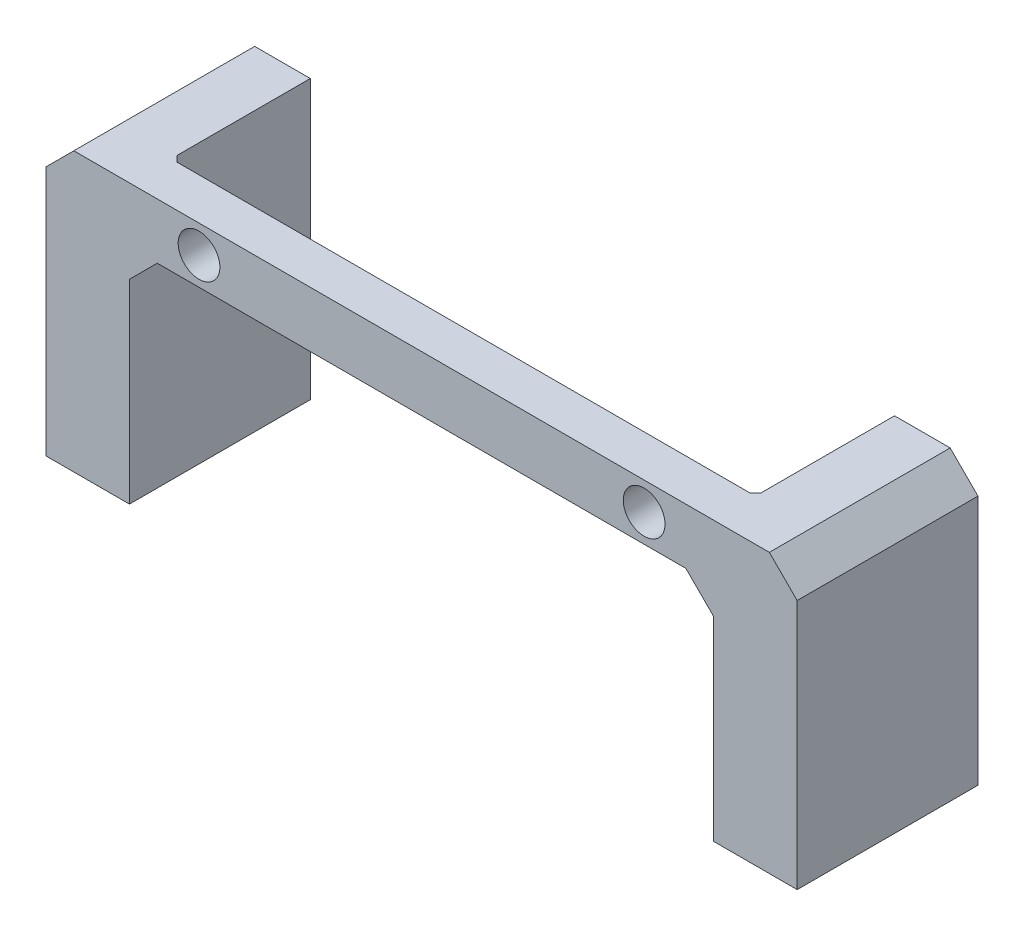
ISO-10303-21;
HEADER;
FILE_DESCRIPTION(('STEP AP214'),'2;1');
FILE_NAME('part.step','',(''),(''),'','','');
FILE_SCHEMA(('AUTOMOTIVE_DESIGN { 1 0 10303 214 1 1 1 1 }'));
ENDSEC;
DATA;
#1=APPLICATION_CONTEXT('core data for automotive mechanical design processes');
#2=APPLICATION_PROTOCOL_DEFINITION('international standard','automotive_design',2000,#1);
#3=PRODUCT_CONTEXT('',#1,'mechanical');
#4=PRODUCT('Part','Part','',(#3));
#5=PRODUCT_RELATED_PRODUCT_CATEGORY('part','',(#4));
#6=PRODUCT_DEFINITION_FORMATION('','',#4);
#7=PRODUCT_DEFINITION_CONTEXT('part definition',#1,'design');
#8=PRODUCT_DEFINITION('design','',#6,#7);
#9=PRODUCT_DEFINITION_SHAPE('','',#8);
#10=(LENGTH_UNIT() NAMED_UNIT(*) SI_UNIT(.MILLI.,.METRE.));
#11=(NAMED_UNIT(*) PLANE_ANGLE_UNIT() SI_UNIT($,.RADIAN.));
#12=(NAMED_UNIT(*) SI_UNIT($,.STERADIAN.) SOLID_ANGLE_UNIT());
#13=UNCERTAINTY_MEASURE_WITH_UNIT(LENGTH_MEASURE(1.E-05),#10,'distance_accuracy_value','');
#14=(GEOMETRIC_REPRESENTATION_CONTEXT(3) GLOBAL_UNCERTAINTY_ASSIGNED_CONTEXT((#13)) GLOBAL_UNIT_ASSIGNED_CONTEXT((#10,
#11,#12)) REPRESENTATION_CONTEXT('',''));
#15=CARTESIAN_POINT('',(0.,0.,0.));
#16=DIRECTION('',(0.,0.,1.));
#17=DIRECTION('',(1.,0.,0.));
#18=AXIS2_PLACEMENT_3D('',#15,#16,#17);
#19=CARTESIAN_POINT('',(0.,0.,0.));
#20=DIRECTION('',(0.,0.,1.));
#21=DIRECTION('',(1.,0.,0.));
#22=AXIS2_PLACEMENT_3D('',#19,#20,#21);
#23=PLANE('',#22);
#24=DIRECTION('',(0.,-1.,0.));
#25=VECTOR('',#24,1.);
#26=CARTESIAN_POINT('',(-27.,10.,0.));
#27=LINE('',#26,#25);
#28=CARTESIAN_POINT('',(-27.,8.00000000000001,0.));
#29=VERTEX_POINT('',#28);
#30=CARTESIAN_POINT('',(-27.,-10.,0.));
#31=VERTEX_POINT('',#30);
#32=EDGE_CURVE('E191',#29,#31,#27,.T.);
#33=ORIENTED_EDGE('',*,*,#32,.F.);
#34=DIRECTION('',(-0.707106781186549,-0.707106781186546,0.));
#35=VECTOR('',#34,1.);
#36=CARTESIAN_POINT('',(-27.,8.00000000000001,0.));
#37=LINE('',#36,#35);
#38=CARTESIAN_POINT('',(-25.,10.,0.));
#39=VERTEX_POINT('',#38);
#40=EDGE_CURVE('E223',#29,#39,#37,.F.);
#41=ORIENTED_EDGE('',*,*,#40,.T.);
#42=DIRECTION('',(-1.,0.,0.));
#43=VECTOR('',#42,1.);
#44=CARTESIAN_POINT('',(-27.,10.,0.));
#45=LINE('',#44,#43);
#46=CARTESIAN_POINT('',(-21.,10.,0.));
#47=VERTEX_POINT('',#46);
#48=EDGE_CURVE('E166',#47,#39,#45,.T.);
#49=ORIENTED_EDGE('',*,*,#48,.F.);
#50=DIRECTION('',(0.,-1.,0.));
#51=VECTOR('',#50,1.);
#52=CARTESIAN_POINT('',(-21.,6.,0.));
#53=LINE('',#52,#51);
#54=CARTESIAN_POINT('',(-21.,-10.,0.));
#55=VERTEX_POINT('',#54);
#56=EDGE_CURVE('E173',#47,#55,#53,.T.);
#57=ORIENTED_EDGE('',*,*,#56,.T.);
#58=DIRECTION('',(1.,0.,0.));
#59=VECTOR('',#58,1.);
#60=CARTESIAN_POINT('',(-27.,-10.,0.));
#61=LINE('',#60,#59);
#62=EDGE_CURVE('E206',#31,#55,#61,.T.);
#63=ORIENTED_EDGE('',*,*,#62,.F.);
#64=EDGE_LOOP('',(#33,#41,#49,#57,#63));
#65=FACE_BOUND('',#64,.T.);
#66=ADVANCED_FACE('F33',(#65),#23,.F.);
#67=CARTESIAN_POINT('',(-27.,-10.,13.));
#68=DIRECTION('',(0.,1.,0.));
#69=DIRECTION('',(0.,0.,1.));
#70=AXIS2_PLACEMENT_3D('',#67,#68,#69);
#71=PLANE('',#70);
#72=CARTESIAN_POINT('',(-24.,-10.,5.));
#73=DIRECTION('',(0.,-1.,0.));
#74=DIRECTION('',(0.,0.,-1.));
#75=AXIS2_PLACEMENT_3D('',#72,#73,#74);
#76=CIRCLE('',#75,1.5);
#77=CARTESIAN_POINT('',(-24.,-10.,3.5));
#78=VERTEX_POINT('',#77);
#79=EDGE_CURVE('E291',#78,#78,#76,.T.);
#80=ORIENTED_EDGE('',*,*,#79,.F.);
#81=EDGE_LOOP('',(#80));
#82=FACE_BOUND('',#81,.T.);
#83=ORIENTED_EDGE('',*,*,#62,.T.);
#84=DIRECTION('',(0.,0.,1.));
#85=VECTOR('',#84,1.);
#86=CARTESIAN_POINT('',(-21.,-10.,0.));
#87=LINE('',#86,#85);
#88=CARTESIAN_POINT('',(-21.,-10.,13.));
#89=VERTEX_POINT('',#88);
#90=EDGE_CURVE('E172',#55,#89,#87,.T.);
#91=ORIENTED_EDGE('',*,*,#90,.T.);
#92=DIRECTION('',(1.,0.,0.));
#93=VECTOR('',#92,1.);
#94=CARTESIAN_POINT('',(-27.,-10.,13.));
#95=LINE('',#94,#93);
#96=CARTESIAN_POINT('',(-27.,-10.,13.));
#97=VERTEX_POINT('',#96);
#98=EDGE_CURVE('E195',#97,#89,#95,.T.);
#99=ORIENTED_EDGE('',*,*,#98,.F.);
#100=DIRECTION('',(0.,0.,-1.));
#101=VECTOR('',#100,1.);
#102=CARTESIAN_POINT('',(-27.,-10.,13.));
#103=LINE('',#102,#101);
#104=EDGE_CURVE('E214',#97,#31,#103,.T.);
#105=ORIENTED_EDGE('',*,*,#104,.T.);
#106=EDGE_LOOP('',(#83,#91,#99,#105));
#107=FACE_BOUND('',#106,.T.);
#108=ADVANCED_FACE('F327',(#82,#107),#71,.F.);
#109=CARTESIAN_POINT('',(-27.,10.,13.));
#110=DIRECTION('',(1.,0.,0.));
#111=DIRECTION('',(0.,0.,-1.));
#112=AXIS2_PLACEMENT_3D('',#109,#110,#111);
#113=PLANE('',#112);
#114=DIRECTION('',(0.,-1.,0.));
#115=VECTOR('',#114,1.);
#116=CARTESIAN_POINT('',(-27.,10.,13.));
#117=LINE('',#116,#115);
#118=CARTESIAN_POINT('',(-27.,8.00000000000001,13.));
#119=VERTEX_POINT('',#118);
#120=EDGE_CURVE('E165',#119,#97,#117,.T.);
#121=ORIENTED_EDGE('',*,*,#120,.F.);
#122=DIRECTION('',(0.,0.,-1.));
#123=VECTOR('',#122,1.);
#124=CARTESIAN_POINT('',(-27.,8.00000000000001,13.));
#125=LINE('',#124,#123);
#126=EDGE_CURVE('E217',#119,#29,#125,.T.);
#127=ORIENTED_EDGE('',*,*,#126,.T.);
#128=ORIENTED_EDGE('',*,*,#32,.T.);
#129=ORIENTED_EDGE('',*,*,#104,.F.);
#130=EDGE_LOOP('',(#121,#127,#128,#129));
#131=FACE_BOUND('',#130,.T.);
#132=ADVANCED_FACE('F320',(#131),#113,.F.);
#133=CARTESIAN_POINT('',(24.,-10.,5.));
#134=DIRECTION('',(0.,-1.,0.));
#135=DIRECTION('',(0.,0.,1.));
#136=AXIS2_PLACEMENT_3D('',#133,#134,#135);
#137=CIRCLE('',#136,1.5);
#138=CARTESIAN_POINT('',(24.,-10.,3.5));
#139=VERTEX_POINT('',#138);
#140=EDGE_CURVE('E287',#139,#139,#137,.T.);
#141=ORIENTED_EDGE('',*,*,#140,.F.);
#142=EDGE_LOOP('',(#141));
#143=FACE_BOUND('',#142,.T.);
#144=CARTESIAN_POINT('',(21.,-10.,13.));
#145=VERTEX_POINT('',#144);
#146=CARTESIAN_POINT('',(27.,-10.,13.));
#147=VERTEX_POINT('',#146);
#148=EDGE_CURVE('E194',#145,#147,#95,.T.);
#149=ORIENTED_EDGE('',*,*,#148,.F.);
#150=DIRECTION('',(0.,0.,1.));
#151=VECTOR('',#150,1.);
#152=CARTESIAN_POINT('',(21.,-10.,0.));
#153=LINE('',#152,#151);
#154=CARTESIAN_POINT('',(21.,-10.,0.));
#155=VERTEX_POINT('',#154);
#156=EDGE_CURVE('E176',#155,#145,#153,.T.);
#157=ORIENTED_EDGE('',*,*,#156,.F.);
#158=CARTESIAN_POINT('',(27.,-10.,0.));
#159=VERTEX_POINT('',#158);
#160=EDGE_CURVE('E171',#155,#159,#61,.T.);
#161=ORIENTED_EDGE('',*,*,#160,.T.);
#162=DIRECTION('',(0.,0.,-1.));
#163=VECTOR('',#162,1.);
#164=CARTESIAN_POINT('',(27.,-10.,13.));
#165=LINE('',#164,#163);
#166=EDGE_CURVE('E204',#147,#159,#165,.T.);
#167=ORIENTED_EDGE('',*,*,#166,.F.);
#168=EDGE_LOOP('',(#149,#157,#161,#167));
#169=FACE_BOUND('',#168,.T.);
#170=ADVANCED_FACE('F344',(#143,#169),#71,.F.);
#171=CARTESIAN_POINT('',(27.,10.,13.));
#172=DIRECTION('',(-1.,0.,0.));
#173=DIRECTION('',(0.,0.,1.));
#174=AXIS2_PLACEMENT_3D('',#171,#172,#173);
#175=PLANE('',#174);
#176=DIRECTION('',(0.,1.,0.));
#177=VECTOR('',#176,1.);
#178=CARTESIAN_POINT('',(27.,10.,0.));
#179=LINE('',#178,#177);
#180=CARTESIAN_POINT('',(27.,8.,0.));
#181=VERTEX_POINT('',#180);
#182=EDGE_CURVE('E209',#159,#181,#179,.T.);
#183=ORIENTED_EDGE('',*,*,#182,.T.);
#184=DIRECTION('',(0.,0.,1.));
#185=VECTOR('',#184,1.);
#186=CARTESIAN_POINT('',(27.,8.,13.));
#187=LINE('',#186,#185);
#188=CARTESIAN_POINT('',(27.,8.,13.));
#189=VERTEX_POINT('',#188);
#190=EDGE_CURVE('E234',#181,#189,#187,.T.);
#191=ORIENTED_EDGE('',*,*,#190,.T.);
#192=DIRECTION('',(0.,1.,0.));
#193=VECTOR('',#192,1.);
#194=CARTESIAN_POINT('',(27.,10.,13.));
#195=LINE('',#194,#193);
#196=EDGE_CURVE('E198',#147,#189,#195,.T.);
#197=ORIENTED_EDGE('',*,*,#196,.F.);
#198=ORIENTED_EDGE('',*,*,#166,.T.);
#199=EDGE_LOOP('',(#183,#191,#197,#198));
#200=FACE_BOUND('',#199,.T.);
#201=ADVANCED_FACE('F351',(#200),#175,.F.);
#202=CARTESIAN_POINT('',(-27.,10.,13.));
#203=DIRECTION('',(0.,-1.,0.));
#204=DIRECTION('',(1.,0.,0.));
#205=AXIS2_PLACEMENT_3D('',#202,#203,#204);
#206=PLANE('',#205);
#207=ORIENTED_EDGE('',*,*,#48,.T.);
#208=DIRECTION('',(0.,0.,1.));
#209=VECTOR('',#208,1.);
#210=CARTESIAN_POINT('',(-25.,10.,13.));
#211=LINE('',#210,#209);
#212=CARTESIAN_POINT('',(-25.,10.,13.));
#213=VERTEX_POINT('',#212);
#214=EDGE_CURVE('E226',#39,#213,#211,.T.);
#215=ORIENTED_EDGE('',*,*,#214,.T.);
#216=DIRECTION('',(-1.,0.,0.));
#217=VECTOR('',#216,1.);
#218=CARTESIAN_POINT('',(-27.,10.,13.));
#219=LINE('',#218,#217);
#220=CARTESIAN_POINT('',(25.,10.,13.));
#221=VERTEX_POINT('',#220);
#222=EDGE_CURVE('E201',#221,#213,#219,.T.);
#223=ORIENTED_EDGE('',*,*,#222,.F.);
#224=DIRECTION('',(0.,0.,-1.));
#225=VECTOR('',#224,1.);
#226=CARTESIAN_POINT('',(25.,10.,13.));
#227=LINE('',#226,#225);
#228=CARTESIAN_POINT('',(25.,10.,0.));
#229=VERTEX_POINT('',#228);
#230=EDGE_CURVE('E163',#221,#229,#227,.T.);
#231=ORIENTED_EDGE('',*,*,#230,.T.);
#232=CARTESIAN_POINT('',(21.,10.,0.));
#233=VERTEX_POINT('',#232);
#234=EDGE_CURVE('E158',#229,#233,#45,.T.);
#235=ORIENTED_EDGE('',*,*,#234,.T.);
#236=DIRECTION('',(0.,0.,-1.));
#237=VECTOR('',#236,1.);
#238=CARTESIAN_POINT('',(21.,10.,0.));
#239=LINE('',#238,#237);
#240=CARTESIAN_POINT('',(21.,10.,9.59999999999999));
#241=VERTEX_POINT('',#240);
#242=EDGE_CURVE('E145',#241,#233,#239,.T.);
#243=ORIENTED_EDGE('',*,*,#242,.F.);
#244=DIRECTION('',(0.707106781186544,0.,-0.707106781186551));
#245=VECTOR('',#244,1.);
#246=CARTESIAN_POINT('',(-4.6999999999998,10.,35.3));
#247=LINE('',#246,#245);
#248=CARTESIAN_POINT('',(20.6,10.,10.));
#249=VERTEX_POINT('',#248);
#250=EDGE_CURVE('E261',#241,#249,#247,.F.);
#251=ORIENTED_EDGE('',*,*,#250,.T.);
#252=DIRECTION('',(1.,0.,0.));
#253=VECTOR('',#252,1.);
#254=CARTESIAN_POINT('',(-21.,10.,10.));
#255=LINE('',#254,#253);
#256=CARTESIAN_POINT('',(-20.6,10.,10.));
#257=VERTEX_POINT('',#256);
#258=EDGE_CURVE('E154',#257,#249,#255,.T.);
#259=ORIENTED_EDGE('',*,*,#258,.F.);
#260=DIRECTION('',(0.707106781186548,0.,0.707106781186548));
#261=VECTOR('',#260,1.);
#262=CARTESIAN_POINT('',(-22.3,10.,8.3));
#263=LINE('',#262,#261);
#264=CARTESIAN_POINT('',(-21.,10.,9.59999999999999));
#265=VERTEX_POINT('',#264);
#266=EDGE_CURVE('E41',#257,#265,#263,.F.);
#267=ORIENTED_EDGE('',*,*,#266,.T.);
#268=DIRECTION('',(0.,0.,1.));
#269=VECTOR('',#268,1.);
#270=CARTESIAN_POINT('',(-21.,10.,0.));
#271=LINE('',#270,#269);
#272=EDGE_CURVE('E278',#47,#265,#271,.T.);
#273=ORIENTED_EDGE('',*,*,#272,.F.);
#274=EDGE_LOOP('',(#207,#215,#223,#231,#235,#243,#251,#259,#267,#273));
#275=FACE_BOUND('',#274,.T.);
#276=ADVANCED_FACE('F160',(#275),#206,.F.);
#277=CARTESIAN_POINT('',(0.,0.,13.));
#278=DIRECTION('',(0.,0.,1.));
#279=DIRECTION('',(1.,0.,0.));
#280=AXIS2_PLACEMENT_3D('',#277,#278,#279);
#281=PLANE('',#280);
#282=CARTESIAN_POINT('',(16.,8.,13.));
#283=DIRECTION('',(0.,0.,1.));
#284=DIRECTION('',(1.,0.,0.));
#285=AXIS2_PLACEMENT_3D('',#282,#283,#284);
#286=CIRCLE('',#285,1.5);
#287=CARTESIAN_POINT('',(17.5,8.,13.));
#288=VERTEX_POINT('',#287);
#289=EDGE_CURVE('E297',#288,#288,#286,.T.);
#290=ORIENTED_EDGE('',*,*,#289,.F.);
#291=EDGE_LOOP('',(#290));
#292=FACE_BOUND('',#291,.T.);
#293=CARTESIAN_POINT('',(-16.,7.99999999999998,13.));
#294=DIRECTION('',(0.,0.,1.));
#295=DIRECTION('',(1.,0.,0.));
#296=AXIS2_PLACEMENT_3D('',#293,#294,#295);
#297=CIRCLE('',#296,1.5);
#298=CARTESIAN_POINT('',(-14.5,7.99999999999998,13.));
#299=VERTEX_POINT('',#298);
#300=EDGE_CURVE('E186',#299,#299,#297,.T.);
#301=ORIENTED_EDGE('',*,*,#300,.F.);
#302=EDGE_LOOP('',(#301));
#303=FACE_BOUND('',#302,.T.);
#304=ORIENTED_EDGE('',*,*,#222,.T.);
#305=DIRECTION('',(0.707106781186549,0.707106781186546,0.));
#306=VECTOR('',#305,1.);
#307=CARTESIAN_POINT('',(-17.5,17.5,13.));
#308=LINE('',#307,#306);
#309=EDGE_CURVE('E230',#213,#119,#308,.F.);
#310=ORIENTED_EDGE('',*,*,#309,.T.);
#311=ORIENTED_EDGE('',*,*,#120,.T.);
#312=ORIENTED_EDGE('',*,*,#98,.T.);
#313=DIRECTION('',(0.,-1.,0.));
#314=VECTOR('',#313,1.);
#315=CARTESIAN_POINT('',(-21.,6.,13.));
#316=LINE('',#315,#314);
#317=CARTESIAN_POINT('',(-21.,3.99999999999999,13.));
#318=VERTEX_POINT('',#317);
#319=EDGE_CURVE('E183',#318,#89,#316,.T.);
#320=ORIENTED_EDGE('',*,*,#319,.F.);
#321=DIRECTION('',(-0.707106781186544,-0.707106781186551,0.));
#322=VECTOR('',#321,1.);
#323=CARTESIAN_POINT('',(-21.,3.99999999999999,13.));
#324=LINE('',#323,#322);
#325=CARTESIAN_POINT('',(-19.,6.,13.));
#326=VERTEX_POINT('',#325);
#327=EDGE_CURVE('E248',#318,#326,#324,.F.);
#328=ORIENTED_EDGE('',*,*,#327,.T.);
#329=DIRECTION('',(-1.,0.,0.));
#330=VECTOR('',#329,1.);
#331=CARTESIAN_POINT('',(-21.,6.,13.));
#332=LINE('',#331,#330);
#333=CARTESIAN_POINT('',(19.,6.,13.));
#334=VERTEX_POINT('',#333);
#335=EDGE_CURVE('E179',#334,#326,#332,.T.);
#336=ORIENTED_EDGE('',*,*,#335,.F.);
#337=DIRECTION('',(-0.707106781186552,0.707106781186543,0.));
#338=VECTOR('',#337,1.);
#339=CARTESIAN_POINT('',(19.,6.,13.));
#340=LINE('',#339,#338);
#341=CARTESIAN_POINT('',(21.,4.,13.));
#342=VERTEX_POINT('',#341);
#343=EDGE_CURVE('E244',#334,#342,#340,.F.);
#344=ORIENTED_EDGE('',*,*,#343,.T.);
#345=DIRECTION('',(0.,1.,0.));
#346=VECTOR('',#345,1.);
#347=CARTESIAN_POINT('',(21.,6.,13.));
#348=LINE('',#347,#346);
#349=EDGE_CURVE('E185',#145,#342,#348,.T.);
#350=ORIENTED_EDGE('',*,*,#349,.F.);
#351=ORIENTED_EDGE('',*,*,#148,.T.);
#352=ORIENTED_EDGE('',*,*,#196,.T.);
#353=DIRECTION('',(0.707106781186546,-0.707106781186549,0.));
#354=VECTOR('',#353,1.);
#355=CARTESIAN_POINT('',(17.5000000000001,17.5,13.));
#356=LINE('',#355,#354);
#357=EDGE_CURVE('E228',#189,#221,#356,.F.);
#358=ORIENTED_EDGE('',*,*,#357,.T.);
#359=EDGE_LOOP('',(#304,#310,#311,#312,#320,#328,#336,#344,#350,#351,#352,#358));
#360=FACE_BOUND('',#359,.T.);
#361=ADVANCED_FACE('F306',(#292,#303,#360),#281,.T.);
#362=ORIENTED_EDGE('',*,*,#234,.F.);
#363=DIRECTION('',(-0.707106781186546,0.707106781186549,0.));
#364=VECTOR('',#363,1.);
#365=CARTESIAN_POINT('',(25.,10.,0.));
#366=LINE('',#365,#364);
#367=EDGE_CURVE('E232',#229,#181,#366,.F.);
#368=ORIENTED_EDGE('',*,*,#367,.T.);
#369=ORIENTED_EDGE('',*,*,#182,.F.);
#370=ORIENTED_EDGE('',*,*,#160,.F.);
#371=DIRECTION('',(0.,1.,0.));
#372=VECTOR('',#371,1.);
#373=CARTESIAN_POINT('',(21.,6.,0.));
#374=LINE('',#373,#372);
#375=EDGE_CURVE('E149',#155,#233,#374,.T.);
#376=ORIENTED_EDGE('',*,*,#375,.T.);
#377=EDGE_LOOP('',(#362,#368,#369,#370,#376));
#378=FACE_BOUND('',#377,.T.);
#379=ADVANCED_FACE('F169',(#378),#23,.F.);
#380=CARTESIAN_POINT('',(-21.,6.,0.));
#381=DIRECTION('',(-1.,0.,0.));
#382=DIRECTION('',(0.,-1.,0.));
#383=AXIS2_PLACEMENT_3D('',#380,#381,#382);
#384=PLANE('',#383);
#385=ORIENTED_EDGE('',*,*,#272,.T.);
#386=DIRECTION('',(0.,-1.,0.));
#387=VECTOR('',#386,1.);
#388=CARTESIAN_POINT('',(-21.,3.99999999999999,9.59999999999999));
#389=LINE('',#388,#387);
#390=CARTESIAN_POINT('',(-21.,3.99999999999999,9.59999999999999));
#391=VERTEX_POINT('',#390);
#392=EDGE_CURVE('E259',#265,#391,#389,.T.);
#393=ORIENTED_EDGE('',*,*,#392,.T.);
#394=DIRECTION('',(0.,0.,1.));
#395=VECTOR('',#394,1.);
#396=CARTESIAN_POINT('',(-21.,3.99999999999999,13.));
#397=LINE('',#396,#395);
#398=EDGE_CURVE('E47',#391,#318,#397,.T.);
#399=ORIENTED_EDGE('',*,*,#398,.T.);
#400=ORIENTED_EDGE('',*,*,#319,.T.);
#401=ORIENTED_EDGE('',*,*,#90,.F.);
#402=ORIENTED_EDGE('',*,*,#56,.F.);
#403=EDGE_LOOP('',(#385,#393,#399,#400,#401,#402));
#404=FACE_BOUND('',#403,.T.);
#405=ADVANCED_FACE('F331',(#404),#384,.F.);
#406=CARTESIAN_POINT('',(-21.,6.,0.));
#407=DIRECTION('',(0.,1.,0.));
#408=DIRECTION('',(0.,0.,1.));
#409=AXIS2_PLACEMENT_3D('',#406,#407,#408);
#410=PLANE('',#409);
#411=DIRECTION('',(1.,0.,0.));
#412=VECTOR('',#411,1.);
#413=CARTESIAN_POINT('',(-21.,6.,10.));
#414=LINE('',#413,#412);
#415=CARTESIAN_POINT('',(-19.,6.,10.));
#416=VERTEX_POINT('',#415);
#417=CARTESIAN_POINT('',(19.,6.,10.));
#418=VERTEX_POINT('',#417);
#419=EDGE_CURVE('E284',#416,#418,#414,.T.);
#420=ORIENTED_EDGE('',*,*,#419,.T.);
#421=DIRECTION('',(0.,0.,1.));
#422=VECTOR('',#421,1.);
#423=CARTESIAN_POINT('',(19.,6.,13.));
#424=LINE('',#423,#422);
#425=EDGE_CURVE('E238',#418,#334,#424,.T.);
#426=ORIENTED_EDGE('',*,*,#425,.T.);
#427=ORIENTED_EDGE('',*,*,#335,.T.);
#428=DIRECTION('',(0.,0.,-1.));
#429=VECTOR('',#428,1.);
#430=CARTESIAN_POINT('',(-19.,6.,10.));
#431=LINE('',#430,#429);
#432=EDGE_CURVE('E236',#326,#416,#431,.T.);
#433=ORIENTED_EDGE('',*,*,#432,.T.);
#434=EDGE_LOOP('',(#420,#426,#427,#433));
#435=FACE_BOUND('',#434,.T.);
#436=ADVANCED_FACE('F340',(#435),#410,.F.);
#437=CARTESIAN_POINT('',(21.,6.,0.));
#438=DIRECTION('',(1.,0.,0.));
#439=DIRECTION('',(0.,1.,0.));
#440=AXIS2_PLACEMENT_3D('',#437,#438,#439);
#441=PLANE('',#440);
#442=DIRECTION('',(0.,0.,-1.));
#443=VECTOR('',#442,1.);
#444=CARTESIAN_POINT('',(21.,4.,10.));
#445=LINE('',#444,#443);
#446=CARTESIAN_POINT('',(21.,4.,9.59999999999999));
#447=VERTEX_POINT('',#446);
#448=EDGE_CURVE('E241',#342,#447,#445,.T.);
#449=ORIENTED_EDGE('',*,*,#448,.T.);
#450=DIRECTION('',(0.,1.,0.));
#451=VECTOR('',#450,1.);
#452=CARTESIAN_POINT('',(21.,10.,9.59999999999999));
#453=LINE('',#452,#451);
#454=EDGE_CURVE('E152',#447,#241,#453,.T.);
#455=ORIENTED_EDGE('',*,*,#454,.T.);
#456=ORIENTED_EDGE('',*,*,#242,.T.);
#457=ORIENTED_EDGE('',*,*,#375,.F.);
#458=ORIENTED_EDGE('',*,*,#156,.T.);
#459=ORIENTED_EDGE('',*,*,#349,.T.);
#460=EDGE_LOOP('',(#449,#455,#456,#457,#458,#459));
#461=FACE_BOUND('',#460,.T.);
#462=ADVANCED_FACE('F147',(#461),#441,.F.);
#463=CARTESIAN_POINT('',(-16.,7.99999999999998,0.));
#464=DIRECTION('',(0.,0.,1.));
#465=DIRECTION('',(1.,0.,0.));
#466=AXIS2_PLACEMENT_3D('',#463,#464,#465);
#467=CYLINDRICAL_SURFACE('',#466,1.5);
#468=CARTESIAN_POINT('',(-16.,7.99999999999998,10.));
#469=DIRECTION('',(0.,0.,1.));
#470=DIRECTION('',(1.,0.,0.));
#471=AXIS2_PLACEMENT_3D('',#468,#469,#470);
#472=CIRCLE('',#471,1.5);
#473=CARTESIAN_POINT('',(-14.5,7.99999999999998,10.));
#474=VERTEX_POINT('',#473);
#475=EDGE_CURVE('E220',#474,#474,#472,.F.);
#476=CARTESIAN_POINT('',(-14.5,7.99999999999998,10.));
#477=CARTESIAN_POINT('',(-14.5,7.99999999999998,10.03125));
#478=CARTESIAN_POINT('',(-14.5,7.99999999999998,10.0625));
#479=CARTESIAN_POINT('',(-14.5,7.99999999999998,10.125));
#480=CARTESIAN_POINT('',(-14.5,7.99999999999998,10.15625));
#481=CARTESIAN_POINT('',(-14.5,7.99999999999998,10.21875));
#482=CARTESIAN_POINT('',(-14.5,7.99999999999998,10.25));
#483=CARTESIAN_POINT('',(-14.5,7.99999999999998,10.3125));
#484=CARTESIAN_POINT('',(-14.5,7.99999999999998,10.34375));
#485=CARTESIAN_POINT('',(-14.5,7.99999999999998,10.40625));
#486=CARTESIAN_POINT('',(-14.5,7.99999999999998,10.4375));
#487=CARTESIAN_POINT('',(-14.5,7.99999999999998,10.5));
#488=CARTESIAN_POINT('',(-14.5,7.99999999999998,10.53125));
#489=CARTESIAN_POINT('',(-14.5,7.99999999999998,10.59375));
#490=CARTESIAN_POINT('',(-14.5,7.99999999999998,10.625));
#491=CARTESIAN_POINT('',(-14.5,7.99999999999998,10.6875));
#492=CARTESIAN_POINT('',(-14.5,7.99999999999998,10.71875));
#493=CARTESIAN_POINT('',(-14.5,7.99999999999998,10.78125));
#494=CARTESIAN_POINT('',(-14.5,7.99999999999998,10.8125));
#495=CARTESIAN_POINT('',(-14.5,7.99999999999998,10.875));
#496=CARTESIAN_POINT('',(-14.5,7.99999999999998,10.90625));
#497=CARTESIAN_POINT('',(-14.5,7.99999999999998,10.96875));
#498=CARTESIAN_POINT('',(-14.5,7.99999999999998,11.));
#499=CARTESIAN_POINT('',(-14.5,7.99999999999998,11.0625));
#500=CARTESIAN_POINT('',(-14.5,7.99999999999998,11.09375));
#501=CARTESIAN_POINT('',(-14.5,7.99999999999998,11.15625));
#502=CARTESIAN_POINT('',(-14.5,7.99999999999998,11.1875));
#503=CARTESIAN_POINT('',(-14.5,7.99999999999998,11.25));
#504=CARTESIAN_POINT('',(-14.5,7.99999999999998,11.28125));
#505=CARTESIAN_POINT('',(-14.5,7.99999999999998,11.34375));
#506=CARTESIAN_POINT('',(-14.5,7.99999999999998,11.375));
#507=CARTESIAN_POINT('',(-14.5,7.99999999999998,11.4375));
#508=CARTESIAN_POINT('',(-14.5,7.99999999999998,11.46875));
#509=CARTESIAN_POINT('',(-14.5,7.99999999999998,11.53125));
#510=CARTESIAN_POINT('',(-14.5,7.99999999999998,11.5625));
#511=CARTESIAN_POINT('',(-14.5,7.99999999999998,11.625));
#512=CARTESIAN_POINT('',(-14.5,7.99999999999998,11.65625));
#513=CARTESIAN_POINT('',(-14.5,7.99999999999998,11.71875));
#514=CARTESIAN_POINT('',(-14.5,7.99999999999998,11.75));
#515=CARTESIAN_POINT('',(-14.5,7.99999999999998,11.8125));
#516=CARTESIAN_POINT('',(-14.5,7.99999999999998,11.84375));
#517=CARTESIAN_POINT('',(-14.5,7.99999999999998,11.90625));
#518=CARTESIAN_POINT('',(-14.5,7.99999999999998,11.9375));
#519=CARTESIAN_POINT('',(-14.5,7.99999999999998,12.));
#520=CARTESIAN_POINT('',(-14.5,7.99999999999998,12.03125));
#521=CARTESIAN_POINT('',(-14.5,7.99999999999998,12.09375));
#522=CARTESIAN_POINT('',(-14.5,7.99999999999998,12.125));
#523=CARTESIAN_POINT('',(-14.5,7.99999999999998,12.1875));
#524=CARTESIAN_POINT('',(-14.5,7.99999999999998,12.21875));
#525=CARTESIAN_POINT('',(-14.5,7.99999999999998,12.28125));
#526=CARTESIAN_POINT('',(-14.5,7.99999999999998,12.3125));
#527=CARTESIAN_POINT('',(-14.5,7.99999999999998,12.375));
#528=CARTESIAN_POINT('',(-14.5,7.99999999999998,12.40625));
#529=CARTESIAN_POINT('',(-14.5,7.99999999999998,12.46875));
#530=CARTESIAN_POINT('',(-14.5,7.99999999999998,12.5));
#531=CARTESIAN_POINT('',(-14.5,7.99999999999998,12.5625));
#532=CARTESIAN_POINT('',(-14.5,7.99999999999998,12.59375));
#533=CARTESIAN_POINT('',(-14.5,7.99999999999998,12.65625));
#534=CARTESIAN_POINT('',(-14.5,7.99999999999998,12.6875));
#535=CARTESIAN_POINT('',(-14.5,7.99999999999998,12.75));
#536=CARTESIAN_POINT('',(-14.5,7.99999999999998,12.78125));
#537=CARTESIAN_POINT('',(-14.5,7.99999999999998,12.84375));
#538=CARTESIAN_POINT('',(-14.5,7.99999999999998,12.875));
#539=CARTESIAN_POINT('',(-14.5,7.99999999999998,12.9375));
#540=CARTESIAN_POINT('',(-14.5,7.99999999999998,12.96875));
#541=CARTESIAN_POINT('',(-14.5,7.99999999999998,13.));
#542=B_SPLINE_CURVE_WITH_KNOTS('',3,(#476,#477,#478,#479,#480,#481,#482,#483,#484,#485,#486,
#487,#488,#489,#490,#491,#492,#493,#494,#495,#496,#497,#498,#499,#500,#501,#502,#503,#504,#505,
#506,#507,#508,#509,#510,#511,#512,#513,#514,#515,#516,#517,#518,#519,#520,#521,#522,#523,#524,
#525,#526,#527,#528,#529,#530,#531,#532,#533,#534,#535,#536,#537,#538,#539,#540,#541),
.UNSPECIFIED.,.F.,.F.,(4,2,2,2,2,2,2,2,2,2,2,2,2,2,2,2,2,2,2,2,2,2,2,2,2,2,2,2,2,2,2,2,4),(0.,
0.0937500000000001,0.1875,0.28125,0.375,0.46875,0.5625,0.656250000000001,0.750000000000001,
0.843749999999999,0.937499999999999,1.03125,1.125,1.21875,1.3125,1.40625,1.5,1.59375,1.6875,
1.78125,1.875,1.96875,2.0625,2.15625,2.25,2.34375,2.4375,2.53125,2.625,2.71875,2.8125,2.90625,
3.),.UNSPECIFIED.);
#543=EDGE_CURVE('BSEAM304',#474,#299,#542,.T.);
#544=ORIENTED_EDGE('',*,*,#475,.T.);
#545=ORIENTED_EDGE('',*,*,#300,.T.);
#546=ORIENTED_EDGE('',*,*,#543,.T.);
#547=ORIENTED_EDGE('',*,*,#543,.F.);
#548=EDGE_LOOP('',(#544,#546,#545,#547));
#549=FACE_BOUND('',#548,.T.);
#550=ADVANCED_FACE('F304',(#549),#467,.F.);
#551=CARTESIAN_POINT('',(16.,8.,0.));
#552=DIRECTION('',(0.,0.,1.));
#553=DIRECTION('',(1.,0.,0.));
#554=AXIS2_PLACEMENT_3D('',#551,#552,#553);
#555=CYLINDRICAL_SURFACE('',#554,1.5);
#556=CARTESIAN_POINT('',(16.,8.,10.));
#557=DIRECTION('',(0.,0.,1.));
#558=DIRECTION('',(1.,0.,0.));
#559=AXIS2_PLACEMENT_3D('',#556,#557,#558);
#560=CIRCLE('',#559,1.5);
#561=CARTESIAN_POINT('',(17.5,8.,10.));
#562=VERTEX_POINT('',#561);
#563=EDGE_CURVE('E153',#562,#562,#560,.F.);
#564=CARTESIAN_POINT('',(17.5,8.,10.));
#565=CARTESIAN_POINT('',(17.5,8.,10.03125));
#566=CARTESIAN_POINT('',(17.5,8.,10.0625));
#567=CARTESIAN_POINT('',(17.5,8.,10.125));
#568=CARTESIAN_POINT('',(17.5,8.,10.15625));
#569=CARTESIAN_POINT('',(17.5,8.,10.21875));
#570=CARTESIAN_POINT('',(17.5,8.,10.25));
#571=CARTESIAN_POINT('',(17.5,8.,10.3125));
#572=CARTESIAN_POINT('',(17.5,8.,10.34375));
#573=CARTESIAN_POINT('',(17.5,8.,10.40625));
#574=CARTESIAN_POINT('',(17.5,8.,10.4375));
#575=CARTESIAN_POINT('',(17.5,8.,10.5));
#576=CARTESIAN_POINT('',(17.5,8.,10.53125));
#577=CARTESIAN_POINT('',(17.5,8.,10.59375));
#578=CARTESIAN_POINT('',(17.5,8.,10.625));
#579=CARTESIAN_POINT('',(17.5,8.,10.6875));
#580=CARTESIAN_POINT('',(17.5,8.,10.71875));
#581=CARTESIAN_POINT('',(17.5,8.,10.78125));
#582=CARTESIAN_POINT('',(17.5,8.,10.8125));
#583=CARTESIAN_POINT('',(17.5,8.,10.875));
#584=CARTESIAN_POINT('',(17.5,8.,10.90625));
#585=CARTESIAN_POINT('',(17.5,8.,10.96875));
#586=CARTESIAN_POINT('',(17.5,8.,11.));
#587=CARTESIAN_POINT('',(17.5,8.,11.0625));
#588=CARTESIAN_POINT('',(17.5,8.,11.09375));
#589=CARTESIAN_POINT('',(17.5,8.,11.15625));
#590=CARTESIAN_POINT('',(17.5,8.,11.1875));
#591=CARTESIAN_POINT('',(17.5,8.,11.25));
#592=CARTESIAN_POINT('',(17.5,8.,11.28125));
#593=CARTESIAN_POINT('',(17.5,8.,11.34375));
#594=CARTESIAN_POINT('',(17.5,8.,11.375));
#595=CARTESIAN_POINT('',(17.5,8.,11.4375));
#596=CARTESIAN_POINT('',(17.5,8.,11.46875));
#597=CARTESIAN_POINT('',(17.5,8.,11.53125));
#598=CARTESIAN_POINT('',(17.5,8.,11.5625));
#599=CARTESIAN_POINT('',(17.5,8.,11.625));
#600=CARTESIAN_POINT('',(17.5,8.,11.65625));
#601=CARTESIAN_POINT('',(17.5,8.,11.71875));
#602=CARTESIAN_POINT('',(17.5,8.,11.75));
#603=CARTESIAN_POINT('',(17.5,8.,11.8125));
#604=CARTESIAN_POINT('',(17.5,8.,11.84375));
#605=CARTESIAN_POINT('',(17.5,8.,11.90625));
#606=CARTESIAN_POINT('',(17.5,8.,11.9375));
#607=CARTESIAN_POINT('',(17.5,8.,12.));
#608=CARTESIAN_POINT('',(17.5,8.,12.03125));
#609=CARTESIAN_POINT('',(17.5,8.,12.09375));
#610=CARTESIAN_POINT('',(17.5,8.,12.125));
#611=CARTESIAN_POINT('',(17.5,8.,12.1875));
#612=CARTESIAN_POINT('',(17.5,8.,12.21875));
#613=CARTESIAN_POINT('',(17.5,8.,12.28125));
#614=CARTESIAN_POINT('',(17.5,8.,12.3125));
#615=CARTESIAN_POINT('',(17.5,8.,12.375));
#616=CARTESIAN_POINT('',(17.5,8.,12.40625));
#617=CARTESIAN_POINT('',(17.5,8.,12.46875));
#618=CARTESIAN_POINT('',(17.5,8.,12.5));
#619=CARTESIAN_POINT('',(17.5,8.,12.5625));
#620=CARTESIAN_POINT('',(17.5,8.,12.59375));
#621=CARTESIAN_POINT('',(17.5,8.,12.65625));
#622=CARTESIAN_POINT('',(17.5,8.,12.6875));
#623=CARTESIAN_POINT('',(17.5,8.,12.75));
#624=CARTESIAN_POINT('',(17.5,8.,12.78125));
#625=CARTESIAN_POINT('',(17.5,8.,12.84375));
#626=CARTESIAN_POINT('',(17.5,8.,12.875));
#627=CARTESIAN_POINT('',(17.5,8.,12.9375));
#628=CARTESIAN_POINT('',(17.5,8.,12.96875));
#629=CARTESIAN_POINT('',(17.5,8.,13.));
#630=B_SPLINE_CURVE_WITH_KNOTS('',3,(#564,#565,#566,#567,#568,#569,#570,#571,#572,#573,#574,
#575,#576,#577,#578,#579,#580,#581,#582,#583,#584,#585,#586,#587,#588,#589,#590,#591,#592,#593,
#594,#595,#596,#597,#598,#599,#600,#601,#602,#603,#604,#605,#606,#607,#608,#609,#610,#611,#612,
#613,#614,#615,#616,#617,#618,#619,#620,#621,#622,#623,#624,#625,#626,#627,#628,#629),
.UNSPECIFIED.,.F.,.F.,(4,2,2,2,2,2,2,2,2,2,2,2,2,2,2,2,2,2,2,2,2,2,2,2,2,2,2,2,2,2,2,2,4),(0.,
0.0937500000000001,0.1875,0.28125,0.375,0.46875,0.5625,0.656250000000001,0.750000000000001,
0.843749999999999,0.937499999999999,1.03125,1.125,1.21875,1.3125,1.40625,1.5,1.59375,1.6875,
1.78125,1.875,1.96875,2.0625,2.15625,2.25,2.34375,2.4375,2.53125,2.625,2.71875,2.8125,2.90625,
3.),.UNSPECIFIED.);
#631=EDGE_CURVE('BSEAM381',#562,#288,#630,.T.);
#632=ORIENTED_EDGE('',*,*,#563,.T.);
#633=ORIENTED_EDGE('',*,*,#289,.T.);
#634=ORIENTED_EDGE('',*,*,#631,.T.);
#635=ORIENTED_EDGE('',*,*,#631,.F.);
#636=EDGE_LOOP('',(#632,#634,#633,#635));
#637=FACE_BOUND('',#636,.T.);
#638=ADVANCED_FACE('F381',(#637),#555,.F.);
#639=CARTESIAN_POINT('',(-24.,3.,5.));
#640=DIRECTION('',(0.,-1.,0.));
#641=DIRECTION('',(0.,0.,-1.));
#642=AXIS2_PLACEMENT_3D('',#639,#640,#641);
#643=CYLINDRICAL_SURFACE('',#642,1.5);
#644=CARTESIAN_POINT('',(-24.,3.,5.));
#645=DIRECTION('',(0.,-1.,0.));
#646=DIRECTION('',(0.,0.,-1.));
#647=AXIS2_PLACEMENT_3D('',#644,#645,#646);
#648=CIRCLE('',#647,1.5);
#649=CARTESIAN_POINT('',(-24.,3.,3.5));
#650=VERTEX_POINT('',#649);
#651=EDGE_CURVE('E294',#650,#650,#648,.T.);
#652=CARTESIAN_POINT('',(-24.,3.,3.5));
#653=CARTESIAN_POINT('',(-24.,2.86458333333333,3.5));
#654=CARTESIAN_POINT('',(-24.,2.72916666666666,3.5));
#655=CARTESIAN_POINT('',(-24.,2.45833333333333,3.5));
#656=CARTESIAN_POINT('',(-24.,2.32291666666666,3.5));
#657=CARTESIAN_POINT('',(-24.,2.05208333333333,3.5));
#658=CARTESIAN_POINT('',(-24.,1.91666666666666,3.5));
#659=CARTESIAN_POINT('',(-24.,1.64583333333333,3.5));
#660=CARTESIAN_POINT('',(-24.,1.51041666666666,3.5));
#661=CARTESIAN_POINT('',(-24.,1.23958333333333,3.5));
#662=CARTESIAN_POINT('',(-24.,1.10416666666666,3.5));
#663=CARTESIAN_POINT('',(-24.,0.833333333333331,3.5));
#664=CARTESIAN_POINT('',(-24.,0.697916666666665,3.5));
#665=CARTESIAN_POINT('',(-24.,0.427083333333331,3.5));
#666=CARTESIAN_POINT('',(-24.,0.291666666666665,3.5));
#667=CARTESIAN_POINT('',(-24.,0.0208333333333313,3.5));
#668=CARTESIAN_POINT('',(-24.,-0.114583333333335,3.5));
#669=CARTESIAN_POINT('',(-24.,-0.385416666666669,3.5));
#670=CARTESIAN_POINT('',(-24.,-0.520833333333335,3.5));
#671=CARTESIAN_POINT('',(-24.,-0.791666666666669,3.5));
#672=CARTESIAN_POINT('',(-24.,-0.927083333333335,3.5));
#673=CARTESIAN_POINT('',(-24.,-1.19791666666667,3.5));
#674=CARTESIAN_POINT('',(-24.,-1.33333333333334,3.5));
#675=CARTESIAN_POINT('',(-24.,-1.60416666666667,3.5));
#676=CARTESIAN_POINT('',(-24.,-1.73958333333334,3.5));
#677=CARTESIAN_POINT('',(-24.,-2.01041666666667,3.5));
#678=CARTESIAN_POINT('',(-24.,-2.14583333333334,3.5));
#679=CARTESIAN_POINT('',(-24.,-2.41666666666667,3.5));
#680=CARTESIAN_POINT('',(-24.,-2.55208333333334,3.5));
#681=CARTESIAN_POINT('',(-24.,-2.82291666666667,3.5));
#682=CARTESIAN_POINT('',(-24.,-2.95833333333334,3.5));
#683=CARTESIAN_POINT('',(-24.,-3.22916666666667,3.5));
#684=CARTESIAN_POINT('',(-24.,-3.36458333333334,3.5));
#685=CARTESIAN_POINT('',(-24.,-3.63541666666667,3.5));
#686=CARTESIAN_POINT('',(-24.,-3.77083333333334,3.5));
#687=CARTESIAN_POINT('',(-24.,-4.04166666666667,3.5));
#688=CARTESIAN_POINT('',(-24.,-4.17708333333334,3.5));
#689=CARTESIAN_POINT('',(-24.,-4.44791666666667,3.5));
#690=CARTESIAN_POINT('',(-24.,-4.58333333333334,3.5));
#691=CARTESIAN_POINT('',(-24.,-4.85416666666667,3.5));
#692=CARTESIAN_POINT('',(-24.,-4.98958333333333,3.5));
#693=CARTESIAN_POINT('',(-24.,-5.26041666666667,3.5));
#694=CARTESIAN_POINT('',(-24.,-5.39583333333333,3.5));
#695=CARTESIAN_POINT('',(-24.,-5.66666666666667,3.5));
#696=CARTESIAN_POINT('',(-24.,-5.80208333333334,3.5));
#697=CARTESIAN_POINT('',(-24.,-6.07291666666667,3.5));
#698=CARTESIAN_POINT('',(-24.,-6.20833333333334,3.5));
#699=CARTESIAN_POINT('',(-24.,-6.47916666666667,3.5));
#700=CARTESIAN_POINT('',(-24.,-6.61458333333334,3.5));
#701=CARTESIAN_POINT('',(-24.,-6.88541666666667,3.5));
#702=CARTESIAN_POINT('',(-24.,-7.02083333333333,3.5));
#703=CARTESIAN_POINT('',(-24.,-7.29166666666667,3.5));
#704=CARTESIAN_POINT('',(-24.,-7.42708333333333,3.5));
#705=CARTESIAN_POINT('',(-24.,-7.69791666666667,3.5));
#706=CARTESIAN_POINT('',(-24.,-7.83333333333333,3.5));
#707=CARTESIAN_POINT('',(-24.,-8.10416666666667,3.5));
#708=CARTESIAN_POINT('',(-24.,-8.23958333333334,3.5));
#709=CARTESIAN_POINT('',(-24.,-8.51041666666667,3.5));
#710=CARTESIAN_POINT('',(-24.,-8.64583333333334,3.5));
#711=CARTESIAN_POINT('',(-24.,-8.91666666666667,3.5));
#712=CARTESIAN_POINT('',(-24.,-9.05208333333334,3.5));
#713=CARTESIAN_POINT('',(-24.,-9.32291666666667,3.5));
#714=CARTESIAN_POINT('',(-24.,-9.45833333333333,3.5));
#715=CARTESIAN_POINT('',(-24.,-9.72916666666667,3.5));
#716=CARTESIAN_POINT('',(-24.,-9.86458333333333,3.5));
#717=CARTESIAN_POINT('',(-24.,-10.,3.5));
#718=B_SPLINE_CURVE_WITH_KNOTS('',3,(#652,#653,#654,#655,#656,#657,#658,#659,#660,#661,#662,
#663,#664,#665,#666,#667,#668,#669,#670,#671,#672,#673,#674,#675,#676,#677,#678,#679,#680,#681,
#682,#683,#684,#685,#686,#687,#688,#689,#690,#691,#692,#693,#694,#695,#696,#697,#698,#699,#700,
#701,#702,#703,#704,#705,#706,#707,#708,#709,#710,#711,#712,#713,#714,#715,#716,#717),
.UNSPECIFIED.,.F.,.F.,(4,2,2,2,2,2,2,2,2,2,2,2,2,2,2,2,2,2,2,2,2,2,2,2,2,2,2,2,2,2,2,2,4),(0.,
0.40625,0.8125,1.21875,1.625,2.03125,2.4375,2.84375,3.25,3.65625,4.0625,4.46875,4.875,5.28125,
5.6875,6.09375,6.5,6.90625,7.3125,7.71875,8.125,8.53125,8.9375,9.34375,9.75,10.15625,10.5625,
10.96875,11.375,11.78125,12.1875,12.59375,13.),.UNSPECIFIED.);
#719=EDGE_CURVE('BSEAM385',#650,#78,#718,.T.);
#720=ORIENTED_EDGE('',*,*,#651,.F.);
#721=ORIENTED_EDGE('',*,*,#79,.T.);
#722=ORIENTED_EDGE('',*,*,#719,.T.);
#723=ORIENTED_EDGE('',*,*,#719,.F.);
#724=EDGE_LOOP('',(#720,#722,#721,#723));
#725=FACE_BOUND('',#724,.T.);
#726=ADVANCED_FACE('F385',(#725),#643,.F.);
#727=CARTESIAN_POINT('',(-24.,3.,5.));
#728=DIRECTION('',(0.,-1.,0.));
#729=DIRECTION('',(0.,0.,-1.));
#730=AXIS2_PLACEMENT_3D('',#727,#728,#729);
#731=PLANE('',#730);
#732=ORIENTED_EDGE('',*,*,#651,.T.);
#733=EDGE_LOOP('',(#732));
#734=FACE_BOUND('',#733,.T.);
#735=ADVANCED_FACE('F389',(#734),#731,.T.);
#736=CARTESIAN_POINT('',(24.,3.,5.));
#737=DIRECTION('',(0.,-1.,0.));
#738=DIRECTION('',(0.,0.,-1.));
#739=AXIS2_PLACEMENT_3D('',#736,#737,#738);
#740=CYLINDRICAL_SURFACE('',#739,1.5);
#741=CARTESIAN_POINT('',(24.,3.,5.));
#742=DIRECTION('',(0.,-1.,0.));
#743=DIRECTION('',(0.,0.,1.));
#744=AXIS2_PLACEMENT_3D('',#741,#742,#743);
#745=CIRCLE('',#744,1.5);
#746=CARTESIAN_POINT('',(24.,3.,3.5));
#747=VERTEX_POINT('',#746);
#748=EDGE_CURVE('E288',#747,#747,#745,.T.);
#749=CARTESIAN_POINT('',(24.,3.,3.5));
#750=CARTESIAN_POINT('',(24.,2.86458333333333,3.5));
#751=CARTESIAN_POINT('',(24.,2.72916666666666,3.5));
#752=CARTESIAN_POINT('',(24.,2.45833333333333,3.5));
#753=CARTESIAN_POINT('',(24.,2.32291666666666,3.5));
#754=CARTESIAN_POINT('',(24.,2.05208333333333,3.5));
#755=CARTESIAN_POINT('',(24.,1.91666666666666,3.5));
#756=CARTESIAN_POINT('',(24.,1.64583333333333,3.5));
#757=CARTESIAN_POINT('',(24.,1.51041666666666,3.5));
#758=CARTESIAN_POINT('',(24.,1.23958333333333,3.5));
#759=CARTESIAN_POINT('',(24.,1.10416666666666,3.5));
#760=CARTESIAN_POINT('',(24.,0.833333333333331,3.5));
#761=CARTESIAN_POINT('',(24.,0.697916666666665,3.5));
#762=CARTESIAN_POINT('',(24.,0.427083333333331,3.5));
#763=CARTESIAN_POINT('',(24.,0.291666666666665,3.5));
#764=CARTESIAN_POINT('',(24.,0.0208333333333313,3.5));
#765=CARTESIAN_POINT('',(24.,-0.114583333333335,3.5));
#766=CARTESIAN_POINT('',(24.,-0.385416666666669,3.5));
#767=CARTESIAN_POINT('',(24.,-0.520833333333335,3.5));
#768=CARTESIAN_POINT('',(24.,-0.791666666666669,3.5));
#769=CARTESIAN_POINT('',(24.,-0.927083333333335,3.5));
#770=CARTESIAN_POINT('',(24.,-1.19791666666667,3.5));
#771=CARTESIAN_POINT('',(24.,-1.33333333333334,3.5));
#772=CARTESIAN_POINT('',(24.,-1.60416666666667,3.5));
#773=CARTESIAN_POINT('',(24.,-1.73958333333334,3.5));
#774=CARTESIAN_POINT('',(24.,-2.01041666666667,3.5));
#775=CARTESIAN_POINT('',(24.,-2.14583333333334,3.5));
#776=CARTESIAN_POINT('',(24.,-2.41666666666667,3.5));
#777=CARTESIAN_POINT('',(24.,-2.55208333333334,3.5));
#778=CARTESIAN_POINT('',(24.,-2.82291666666667,3.5));
#779=CARTESIAN_POINT('',(24.,-2.95833333333334,3.5));
#780=CARTESIAN_POINT('',(24.,-3.22916666666667,3.5));
#781=CARTESIAN_POINT('',(24.,-3.36458333333334,3.5));
#782=CARTESIAN_POINT('',(24.,-3.63541666666667,3.5));
#783=CARTESIAN_POINT('',(24.,-3.77083333333334,3.5));
#784=CARTESIAN_POINT('',(24.,-4.04166666666667,3.5));
#785=CARTESIAN_POINT('',(24.,-4.17708333333334,3.5));
#786=CARTESIAN_POINT('',(24.,-4.44791666666667,3.5));
#787=CARTESIAN_POINT('',(24.,-4.58333333333334,3.5));
#788=CARTESIAN_POINT('',(24.,-4.85416666666667,3.5));
#789=CARTESIAN_POINT('',(24.,-4.98958333333333,3.5));
#790=CARTESIAN_POINT('',(24.,-5.26041666666667,3.5));
#791=CARTESIAN_POINT('',(24.,-5.39583333333333,3.5));
#792=CARTESIAN_POINT('',(24.,-5.66666666666667,3.5));
#793=CARTESIAN_POINT('',(24.,-5.80208333333334,3.5));
#794=CARTESIAN_POINT('',(24.,-6.07291666666667,3.5));
#795=CARTESIAN_POINT('',(24.,-6.20833333333334,3.5));
#796=CARTESIAN_POINT('',(24.,-6.47916666666667,3.5));
#797=CARTESIAN_POINT('',(24.,-6.61458333333334,3.5));
#798=CARTESIAN_POINT('',(24.,-6.88541666666667,3.5));
#799=CARTESIAN_POINT('',(24.,-7.02083333333333,3.5));
#800=CARTESIAN_POINT('',(24.,-7.29166666666667,3.5));
#801=CARTESIAN_POINT('',(24.,-7.42708333333333,3.5));
#802=CARTESIAN_POINT('',(24.,-7.69791666666667,3.5));
#803=CARTESIAN_POINT('',(24.,-7.83333333333333,3.5));
#804=CARTESIAN_POINT('',(24.,-8.10416666666667,3.5));
#805=CARTESIAN_POINT('',(24.,-8.23958333333334,3.5));
#806=CARTESIAN_POINT('',(24.,-8.51041666666667,3.5));
#807=CARTESIAN_POINT('',(24.,-8.64583333333334,3.5));
#808=CARTESIAN_POINT('',(24.,-8.91666666666667,3.5));
#809=CARTESIAN_POINT('',(24.,-9.05208333333334,3.5));
#810=CARTESIAN_POINT('',(24.,-9.32291666666667,3.5));
#811=CARTESIAN_POINT('',(24.,-9.45833333333333,3.5));
#812=CARTESIAN_POINT('',(24.,-9.72916666666667,3.5));
#813=CARTESIAN_POINT('',(24.,-9.86458333333333,3.5));
#814=CARTESIAN_POINT('',(24.,-10.,3.5));
#815=B_SPLINE_CURVE_WITH_KNOTS('',3,(#749,#750,#751,#752,#753,#754,#755,#756,#757,#758,#759,
#760,#761,#762,#763,#764,#765,#766,#767,#768,#769,#770,#771,#772,#773,#774,#775,#776,#777,#778,
#779,#780,#781,#782,#783,#784,#785,#786,#787,#788,#789,#790,#791,#792,#793,#794,#795,#796,#797,
#798,#799,#800,#801,#802,#803,#804,#805,#806,#807,#808,#809,#810,#811,#812,#813,#814),
.UNSPECIFIED.,.F.,.F.,(4,2,2,2,2,2,2,2,2,2,2,2,2,2,2,2,2,2,2,2,2,2,2,2,2,2,2,2,2,2,2,2,4),(0.,
0.40625,0.8125,1.21875,1.625,2.03125,2.4375,2.84375,3.25,3.65625,4.0625,4.46875,4.875,5.28125,
5.6875,6.09375,6.5,6.90625,7.3125,7.71875,8.125,8.53125,8.9375,9.34375,9.75,10.15625,10.5625,
10.96875,11.375,11.78125,12.1875,12.59375,13.),.UNSPECIFIED.);
#816=EDGE_CURVE('BSEAM393',#747,#139,#815,.T.);
#817=ORIENTED_EDGE('',*,*,#748,.F.);
#818=ORIENTED_EDGE('',*,*,#140,.T.);
#819=ORIENTED_EDGE('',*,*,#816,.T.);
#820=ORIENTED_EDGE('',*,*,#816,.F.);
#821=EDGE_LOOP('',(#817,#819,#818,#820));
#822=FACE_BOUND('',#821,.T.);
#823=ADVANCED_FACE('F393',(#822),#740,.F.);
#824=CARTESIAN_POINT('',(24.,3.,5.));
#825=DIRECTION('',(0.,1.,0.));
#826=DIRECTION('',(0.,0.,1.));
#827=AXIS2_PLACEMENT_3D('',#824,#825,#826);
#828=PLANE('',#827);
#829=ORIENTED_EDGE('',*,*,#748,.T.);
#830=EDGE_LOOP('',(#829));
#831=FACE_BOUND('',#830,.T.);
#832=ADVANCED_FACE('F397',(#831),#828,.F.);
#833=CARTESIAN_POINT('',(-21.,-10.,10.));
#834=DIRECTION('',(0.,0.,1.));
#835=DIRECTION('',(1.,0.,0.));
#836=AXIS2_PLACEMENT_3D('',#833,#834,#835);
#837=PLANE('',#836);
#838=ORIENTED_EDGE('',*,*,#563,.F.);
#839=EDGE_LOOP('',(#838));
#840=FACE_BOUND('',#839,.T.);
#841=ORIENTED_EDGE('',*,*,#475,.F.);
#842=EDGE_LOOP('',(#841));
#843=FACE_BOUND('',#842,.T.);
#844=ORIENTED_EDGE('',*,*,#258,.T.);
#845=DIRECTION('',(0.,-1.,0.));
#846=VECTOR('',#845,1.);
#847=CARTESIAN_POINT('',(20.6,4.,10.));
#848=LINE('',#847,#846);
#849=CARTESIAN_POINT('',(20.6,4.4,10.));
#850=VERTEX_POINT('',#849);
#851=EDGE_CURVE('E257',#249,#850,#848,.T.);
#852=ORIENTED_EDGE('',*,*,#851,.T.);
#853=DIRECTION('',(0.707106781186552,-0.707106781186543,0.));
#854=VECTOR('',#853,1.);
#855=CARTESIAN_POINT('',(6.99999999999971,18.0000000000001,10.));
#856=LINE('',#855,#854);
#857=EDGE_CURVE('E246',#850,#418,#856,.F.);
#858=ORIENTED_EDGE('',*,*,#857,.T.);
#859=ORIENTED_EDGE('',*,*,#419,.F.);
#860=DIRECTION('',(0.707106781186544,0.707106781186551,0.));
#861=VECTOR('',#860,1.);
#862=CARTESIAN_POINT('',(-28.,-3.00000000000008,10.));
#863=LINE('',#862,#861);
#864=CARTESIAN_POINT('',(-20.6,4.40000000000001,10.));
#865=VERTEX_POINT('',#864);
#866=EDGE_CURVE('E250',#416,#865,#863,.F.);
#867=ORIENTED_EDGE('',*,*,#866,.T.);
#868=DIRECTION('',(0.,1.,0.));
#869=VECTOR('',#868,1.);
#870=CARTESIAN_POINT('',(-20.6,10.,10.));
#871=LINE('',#870,#869);
#872=EDGE_CURVE('E254',#865,#257,#871,.T.);
#873=ORIENTED_EDGE('',*,*,#872,.T.);
#874=EDGE_LOOP('',(#844,#852,#858,#859,#867,#873));
#875=FACE_BOUND('',#874,.T.);
#876=ADVANCED_FACE('F276',(#840,#843,#875),#837,.F.);
#877=CARTESIAN_POINT('',(-27.,8.00000000000001,13.));
#878=DIRECTION('',(0.707106781186546,-0.707106781186549,0.));
#879=DIRECTION('',(0.,0.,-1.));
#880=AXIS2_PLACEMENT_3D('',#877,#878,#879);
#881=PLANE('',#880);
#882=ORIENTED_EDGE('',*,*,#309,.F.);
#883=ORIENTED_EDGE('',*,*,#214,.F.);
#884=ORIENTED_EDGE('',*,*,#40,.F.);
#885=ORIENTED_EDGE('',*,*,#126,.F.);
#886=EDGE_LOOP('',(#882,#883,#884,#885));
#887=FACE_BOUND('',#886,.T.);
#888=ADVANCED_FACE('F317',(#887),#881,.F.);
#889=CARTESIAN_POINT('',(25.,10.,13.));
#890=DIRECTION('',(-0.707106781186549,-0.707106781186546,0.));
#891=DIRECTION('',(0.,0.,-1.));
#892=AXIS2_PLACEMENT_3D('',#889,#890,#891);
#893=PLANE('',#892);
#894=ORIENTED_EDGE('',*,*,#357,.F.);
#895=ORIENTED_EDGE('',*,*,#190,.F.);
#896=ORIENTED_EDGE('',*,*,#367,.F.);
#897=ORIENTED_EDGE('',*,*,#230,.F.);
#898=EDGE_LOOP('',(#894,#895,#896,#897));
#899=FACE_BOUND('',#898,.T.);
#900=ADVANCED_FACE('F350',(#899),#893,.F.);
#901=CARTESIAN_POINT('',(19.,6.,0.));
#902=DIRECTION('',(-0.707106781186543,-0.707106781186552,0.));
#903=DIRECTION('',(0.,0.,-1.));
#904=AXIS2_PLACEMENT_3D('',#901,#902,#903);
#905=PLANE('',#904);
#906=ORIENTED_EDGE('',*,*,#857,.F.);
#907=DIRECTION('',(0.577350269189627,-0.577350269189619,-0.577350269189632));
#908=VECTOR('',#907,1.);
#909=CARTESIAN_POINT('',(22.8666666666667,2.13333333333333,7.73333333333327));
#910=LINE('',#909,#908);
#911=EDGE_CURVE('E263',#850,#447,#910,.T.);
#912=ORIENTED_EDGE('',*,*,#911,.T.);
#913=ORIENTED_EDGE('',*,*,#448,.F.);
#914=ORIENTED_EDGE('',*,*,#343,.F.);
#915=ORIENTED_EDGE('',*,*,#425,.F.);
#916=EDGE_LOOP('',(#906,#912,#913,#914,#915));
#917=FACE_BOUND('',#916,.T.);
#918=ADVANCED_FACE('F269',(#917),#905,.T.);
#919=CARTESIAN_POINT('',(-21.,3.99999999999999,0.));
#920=DIRECTION('',(0.707106781186551,-0.707106781186544,0.));
#921=DIRECTION('',(0.,0.,-1.));
#922=AXIS2_PLACEMENT_3D('',#919,#920,#921);
#923=PLANE('',#922);
#924=ORIENTED_EDGE('',*,*,#866,.F.);
#925=ORIENTED_EDGE('',*,*,#432,.F.);
#926=ORIENTED_EDGE('',*,*,#327,.F.);
#927=ORIENTED_EDGE('',*,*,#398,.F.);
#928=DIRECTION('',(0.577350269189624,0.57735026918963,0.577350269189624));
#929=VECTOR('',#928,1.);
#930=CARTESIAN_POINT('',(-24.2,0.799999999999982,6.40000000000002));
#931=LINE('',#930,#929);
#932=EDGE_CURVE('E11',#391,#865,#931,.T.);
#933=ORIENTED_EDGE('',*,*,#932,.T.);
#934=EDGE_LOOP('',(#924,#925,#926,#927,#933));
#935=FACE_BOUND('',#934,.T.);
#936=ADVANCED_FACE('F336',(#935),#923,.T.);
#937=CARTESIAN_POINT('',(21.,6.,9.59999999999999));
#938=DIRECTION('',(-0.707106781186551,0.,-0.707106781186544));
#939=DIRECTION('',(0.,-1.,0.));
#940=AXIS2_PLACEMENT_3D('',#937,#938,#939);
#941=PLANE('',#940);
#942=ORIENTED_EDGE('',*,*,#911,.F.);
#943=ORIENTED_EDGE('',*,*,#851,.F.);
#944=ORIENTED_EDGE('',*,*,#250,.F.);
#945=ORIENTED_EDGE('',*,*,#454,.F.);
#946=EDGE_LOOP('',(#942,#943,#944,#945));
#947=FACE_BOUND('',#946,.T.);
#948=ADVANCED_FACE('F273',(#947),#941,.T.);
#949=CARTESIAN_POINT('',(-20.6,-10.,10.));
#950=DIRECTION('',(0.707106781186548,0.,-0.707106781186548));
#951=DIRECTION('',(0.,-1.,0.));
#952=AXIS2_PLACEMENT_3D('',#949,#950,#951);
#953=PLANE('',#952);
#954=ORIENTED_EDGE('',*,*,#932,.F.);
#955=ORIENTED_EDGE('',*,*,#392,.F.);
#956=ORIENTED_EDGE('',*,*,#266,.F.);
#957=ORIENTED_EDGE('',*,*,#872,.F.);
#958=EDGE_LOOP('',(#954,#955,#956,#957));
#959=FACE_BOUND('',#958,.T.);
#960=ADVANCED_FACE('F35',(#959),#953,.T.);
#961=CLOSED_SHELL('',(#66,#108,#132,#170,#201,#276,#361,#379,#405,#436,#462,#550,#638,#726,#735,
#823,#832,#876,#888,#900,#918,#936,#948,#960));
#962=MANIFOLD_SOLID_BREP('B2',#961);
#963=ADVANCED_BREP_SHAPE_REPRESENTATION('',(#18,#962),#14);
#964=SHAPE_DEFINITION_REPRESENTATION(#9,#963);
ENDSEC;
END-ISO-10303-21;
